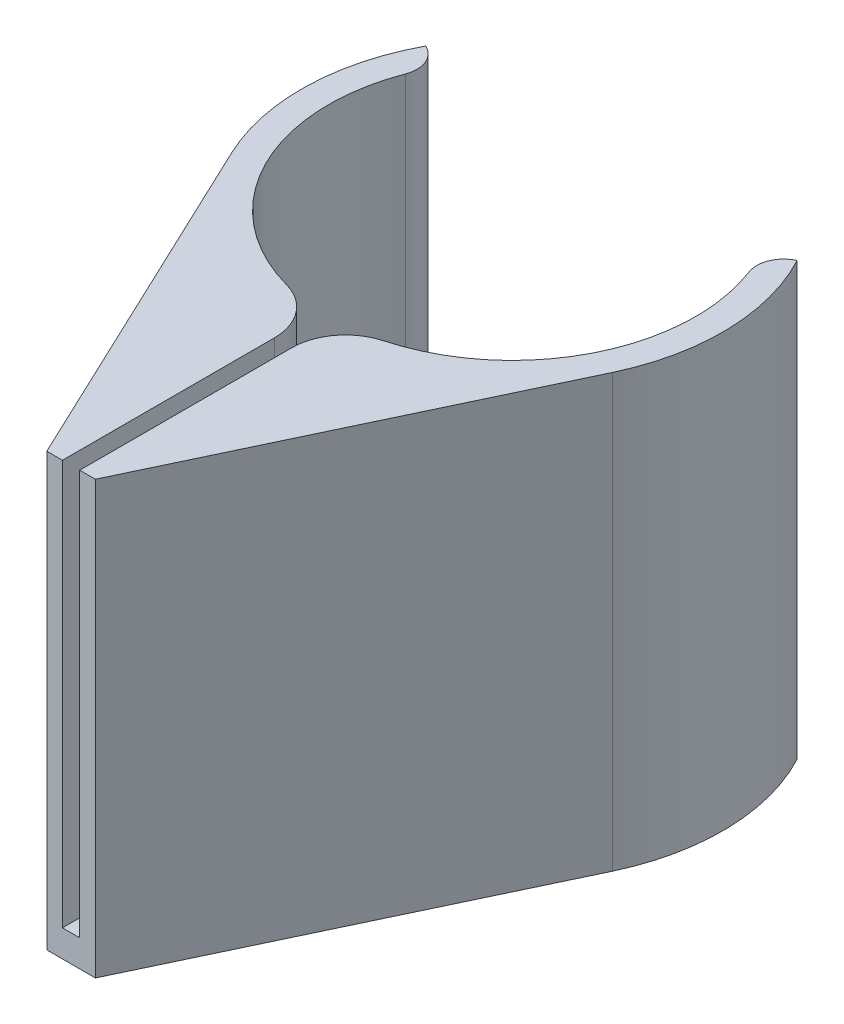
ISO-10303-21;
HEADER;
FILE_DESCRIPTION(('STEP AP214'),'2;1');
FILE_NAME('part.step','',(''),(''),'','','');
FILE_SCHEMA(('AUTOMOTIVE_DESIGN { 1 0 10303 214 1 1 1 1 }'));
ENDSEC;
DATA;
#1=APPLICATION_CONTEXT('core data for automotive mechanical design processes');
#2=APPLICATION_PROTOCOL_DEFINITION('international standard','automotive_design',2000,#1);
#3=PRODUCT_CONTEXT('',#1,'mechanical');
#4=PRODUCT('Part','Part','',(#3));
#5=PRODUCT_RELATED_PRODUCT_CATEGORY('part','',(#4));
#6=PRODUCT_DEFINITION_FORMATION('','',#4);
#7=PRODUCT_DEFINITION_CONTEXT('part definition',#1,'design');
#8=PRODUCT_DEFINITION('design','',#6,#7);
#9=PRODUCT_DEFINITION_SHAPE('','',#8);
#10=(LENGTH_UNIT() NAMED_UNIT(*) SI_UNIT(.MILLI.,.METRE.));
#11=(NAMED_UNIT(*) PLANE_ANGLE_UNIT() SI_UNIT($,.RADIAN.));
#12=(NAMED_UNIT(*) SI_UNIT($,.STERADIAN.) SOLID_ANGLE_UNIT());
#13=UNCERTAINTY_MEASURE_WITH_UNIT(LENGTH_MEASURE(1.E-05),#10,'distance_accuracy_value','');
#14=(GEOMETRIC_REPRESENTATION_CONTEXT(3) GLOBAL_UNCERTAINTY_ASSIGNED_CONTEXT((#13)) GLOBAL_UNIT_ASSIGNED_CONTEXT((#10,
#11,#12)) REPRESENTATION_CONTEXT('',''));
#15=CARTESIAN_POINT('',(0.,0.,0.));
#16=DIRECTION('',(0.,0.,1.));
#17=DIRECTION('',(1.,0.,0.));
#18=AXIS2_PLACEMENT_3D('',#15,#16,#17);
#19=CARTESIAN_POINT('',(0.,80.,0.));
#20=DIRECTION('',(0.,-1.,0.));
#21=DIRECTION('',(0.,0.,-1.));
#22=AXIS2_PLACEMENT_3D('',#19,#20,#21);
#23=CYLINDRICAL_SURFACE('',#22,34.);
#24=CARTESIAN_POINT('',(0.,80.,0.));
#25=DIRECTION('',(0.,1.,0.));
#26=DIRECTION('',(0.,0.,1.));
#27=AXIS2_PLACEMENT_3D('',#24,#25,#26);
#28=CIRCLE('',#27,34.);
#29=CARTESIAN_POINT('',(8.96363636363636,80.,32.797152668189));
#30=VERTEX_POINT('',#29);
#31=CARTESIAN_POINT('',(31.7886601793852,80.,-12.0615539628844));
#32=VERTEX_POINT('',#31);
#33=EDGE_CURVE('E399',#30,#32,#28,.T.);
#34=ORIENTED_EDGE('',*,*,#33,.T.);
#35=DIRECTION('',(0.,-1.,0.));
#36=VECTOR('',#35,1.);
#37=CARTESIAN_POINT('',(31.7886601793852,80.,-12.0615539628844));
#38=LINE('',#37,#36);
#39=CARTESIAN_POINT('',(31.7886601793852,0.,-12.0615539628844));
#40=VERTEX_POINT('',#39);
#41=EDGE_CURVE('E387',#32,#40,#38,.T.);
#42=ORIENTED_EDGE('',*,*,#41,.T.);
#43=CARTESIAN_POINT('',(0.,0.,0.));
#44=DIRECTION('',(0.,1.,0.));
#45=DIRECTION('',(0.,0.,1.));
#46=AXIS2_PLACEMENT_3D('',#43,#44,#45);
#47=CIRCLE('',#46,34.);
#48=CARTESIAN_POINT('',(8.96363636363636,0.,32.797152668189));
#49=VERTEX_POINT('',#48);
#50=EDGE_CURVE('E223',#49,#40,#47,.T.);
#51=ORIENTED_EDGE('',*,*,#50,.F.);
#52=DIRECTION('',(0.,-1.,0.));
#53=VECTOR('',#52,1.);
#54=CARTESIAN_POINT('',(8.96363636363636,80.,32.797152668189));
#55=LINE('',#54,#53);
#56=EDGE_CURVE('E275',#49,#30,#55,.F.);
#57=ORIENTED_EDGE('',*,*,#56,.T.);
#58=EDGE_LOOP('',(#34,#42,#51,#57));
#59=FACE_BOUND('',#58,.T.);
#60=ADVANCED_FACE('F42',(#59),#23,.F.);
#61=CARTESIAN_POINT('',(0.,80.,0.));
#62=DIRECTION('',(0.,1.,0.));
#63=DIRECTION('',(0.,0.,1.));
#64=AXIS2_PLACEMENT_3D('',#61,#62,#63);
#65=PLANE('',#64);
#66=CARTESIAN_POINT('',(-31.7886601793852,80.,-12.0615539628844));
#67=VERTEX_POINT('',#66);
#68=CARTESIAN_POINT('',(-8.96363636363636,80.,32.797152668189));
#69=VERTEX_POINT('',#68);
#70=EDGE_CURVE('E426',#67,#69,#28,.T.);
#71=ORIENTED_EDGE('',*,*,#70,.F.);
#72=CARTESIAN_POINT('',(-36.4634631469418,80.,-13.8353118986027));
#73=DIRECTION('',(0.,1.,0.));
#74=DIRECTION('',(0.,0.,1.));
#75=AXIS2_PLACEMENT_3D('',#72,#73,#74);
#76=CIRCLE('',#75,5.);
#77=CARTESIAN_POINT('',(-33.9634631469418,80.,-18.1654389175249));
#78=VERTEX_POINT('',#77);
#79=EDGE_CURVE('E382',#67,#78,#76,.T.);
#80=ORIENTED_EDGE('',*,*,#79,.T.);
#81=DIRECTION('',(-0.866025403784436,0.,-0.500000000000004));
#82=VECTOR('',#81,1.);
#83=CARTESIAN_POINT('',(-0.625000000000009,80.,1.08253175473055));
#84=LINE('',#83,#82);
#85=CARTESIAN_POINT('',(-34.3826380246011,80.,-18.4074496459791));
#86=VERTEX_POINT('',#85);
#87=EDGE_CURVE('E431',#78,#86,#84,.T.);
#88=ORIENTED_EDGE('',*,*,#87,.T.);
#89=CARTESIAN_POINT('',(0.,80.,0.));
#90=DIRECTION('',(0.,1.,0.));
#91=DIRECTION('',(0.,0.,1.));
#92=AXIS2_PLACEMENT_3D('',#89,#90,#91);
#93=CIRCLE('',#92,39.);
#94=CARTESIAN_POINT('',(-35.2539104463336,80.,16.6781833016037));
#95=VERTEX_POINT('',#94);
#96=EDGE_CURVE('E437',#86,#95,#93,.T.);
#97=ORIENTED_EDGE('',*,*,#96,.T.);
#98=DIRECTION('',(0.427645725682146,0.,0.903946421700861));
#99=VECTOR('',#98,1.);
#100=CARTESIAN_POINT('',(-35.2539104463336,80.,16.6781833016037));
#101=LINE('',#100,#99);
#102=CARTESIAN_POINT('',(-4.50000000000001,80.,81.685));
#103=VERTEX_POINT('',#102);
#104=EDGE_CURVE('E197',#95,#103,#101,.T.);
#105=ORIENTED_EDGE('',*,*,#104,.T.);
#106=DIRECTION('',(1.,0.,0.));
#107=VECTOR('',#106,1.);
#108=CARTESIAN_POINT('',(0.,80.,81.685));
#109=LINE('',#108,#107);
#110=CARTESIAN_POINT('',(-1.6,80.,81.685));
#111=VERTEX_POINT('',#110);
#112=EDGE_CURVE('E187',#103,#111,#109,.T.);
#113=ORIENTED_EDGE('',*,*,#112,.T.);
#114=DIRECTION('',(0.,0.,1.));
#115=VECTOR('',#114,1.);
#116=CARTESIAN_POINT('',(-1.6,80.,81.685));
#117=LINE('',#116,#115);
#118=CARTESIAN_POINT('',(-1.6,80.,42.4433740411858));
#119=VERTEX_POINT('',#118);
#120=EDGE_CURVE('E167',#119,#111,#117,.T.);
#121=ORIENTED_EDGE('',*,*,#120,.F.);
#122=CARTESIAN_POINT('',(-11.6,80.,42.4433740411858));
#123=DIRECTION('',(0.,1.,0.));
#124=DIRECTION('',(0.,0.,1.));
#125=AXIS2_PLACEMENT_3D('',#122,#123,#124);
#126=CIRCLE('',#125,10.);
#127=EDGE_CURVE('E286',#119,#69,#126,.T.);
#128=ORIENTED_EDGE('',*,*,#127,.T.);
#129=EDGE_LOOP('',(#71,#80,#88,#97,#105,#113,#121,#128));
#130=FACE_BOUND('',#129,.T.);
#131=ADVANCED_FACE('F195',(#130),#65,.T.);
#132=CARTESIAN_POINT('',(35.2539104463336,80.,16.6781833016037));
#133=DIRECTION('',(-0.903946421700861,0.,-0.427645725682146));
#134=DIRECTION('',(-0.427645725682146,0.,0.903946421700861));
#135=AXIS2_PLACEMENT_3D('',#132,#133,#134);
#136=PLANE('',#135);
#137=DIRECTION('',(0.427645725682146,0.,-0.903946421700861));
#138=VECTOR('',#137,1.);
#139=CARTESIAN_POINT('',(35.2539104463336,0.,16.6781833016037));
#140=LINE('',#139,#138);
#141=CARTESIAN_POINT('',(4.5,0.,81.685));
#142=VERTEX_POINT('',#141);
#143=CARTESIAN_POINT('',(35.2539104463336,0.,16.6781833016037));
#144=VERTEX_POINT('',#143);
#145=EDGE_CURVE('E211',#142,#144,#140,.T.);
#146=ORIENTED_EDGE('',*,*,#145,.T.);
#147=DIRECTION('',(0.,-1.,0.));
#148=VECTOR('',#147,1.);
#149=CARTESIAN_POINT('',(35.2539104463336,80.,16.6781833016037));
#150=LINE('',#149,#148);
#151=CARTESIAN_POINT('',(35.2539104463336,80.,16.6781833016037));
#152=VERTEX_POINT('',#151);
#153=EDGE_CURVE('E254',#152,#144,#150,.T.);
#154=ORIENTED_EDGE('',*,*,#153,.F.);
#155=DIRECTION('',(0.427645725682146,0.,-0.903946421700861));
#156=VECTOR('',#155,1.);
#157=CARTESIAN_POINT('',(35.2539104463336,80.,16.6781833016037));
#158=LINE('',#157,#156);
#159=CARTESIAN_POINT('',(4.5,80.,81.685));
#160=VERTEX_POINT('',#159);
#161=EDGE_CURVE('E238',#160,#152,#158,.T.);
#162=ORIENTED_EDGE('',*,*,#161,.F.);
#163=DIRECTION('',(0.,-1.,0.));
#164=VECTOR('',#163,1.);
#165=CARTESIAN_POINT('',(4.5,80.,81.685));
#166=LINE('',#165,#164);
#167=EDGE_CURVE('E200',#160,#142,#166,.T.);
#168=ORIENTED_EDGE('',*,*,#167,.T.);
#169=EDGE_LOOP('',(#146,#154,#162,#168));
#170=FACE_BOUND('',#169,.T.);
#171=ADVANCED_FACE('F316',(#170),#136,.F.);
#172=CARTESIAN_POINT('',(0.,80.,0.));
#173=DIRECTION('',(0.,-1.,0.));
#174=DIRECTION('',(0.,0.,-1.));
#175=AXIS2_PLACEMENT_3D('',#172,#173,#174);
#176=CYLINDRICAL_SURFACE('',#175,39.);
#177=CARTESIAN_POINT('',(0.,0.,0.));
#178=DIRECTION('',(0.,1.,0.));
#179=DIRECTION('',(0.,0.,1.));
#180=AXIS2_PLACEMENT_3D('',#177,#178,#179);
#181=CIRCLE('',#180,39.);
#182=CARTESIAN_POINT('',(34.3826380246011,0.,-18.4074496459791));
#183=VERTEX_POINT('',#182);
#184=EDGE_CURVE('E215',#144,#183,#181,.T.);
#185=ORIENTED_EDGE('',*,*,#184,.T.);
#186=DIRECTION('',(0.,-1.,0.));
#187=VECTOR('',#186,1.);
#188=CARTESIAN_POINT('',(34.3826380246011,80.,-18.4074496459791));
#189=LINE('',#188,#187);
#190=CARTESIAN_POINT('',(34.3826380246011,80.,-18.4074496459791));
#191=VERTEX_POINT('',#190);
#192=EDGE_CURVE('E250',#191,#183,#189,.T.);
#193=ORIENTED_EDGE('',*,*,#192,.F.);
#194=CARTESIAN_POINT('',(0.,80.,0.));
#195=DIRECTION('',(0.,1.,0.));
#196=DIRECTION('',(0.,0.,1.));
#197=AXIS2_PLACEMENT_3D('',#194,#195,#196);
#198=CIRCLE('',#197,39.);
#199=EDGE_CURVE('E432',#152,#191,#198,.T.);
#200=ORIENTED_EDGE('',*,*,#199,.F.);
#201=ORIENTED_EDGE('',*,*,#153,.T.);
#202=EDGE_LOOP('',(#185,#193,#200,#201));
#203=FACE_BOUND('',#202,.T.);
#204=ADVANCED_FACE('F372',(#203),#176,.T.);
#205=CARTESIAN_POINT('',(0.625000000000009,80.,1.08253175473055));
#206=DIRECTION('',(-0.500000000000004,0.,-0.866025403784436));
#207=DIRECTION('',(-0.866025403784436,0.,0.500000000000004));
#208=AXIS2_PLACEMENT_3D('',#205,#206,#207);
#209=PLANE('',#208);
#210=DIRECTION('',(0.866025403784436,0.,-0.500000000000004));
#211=VECTOR('',#210,1.);
#212=CARTESIAN_POINT('',(0.625000000000009,0.,1.08253175473055));
#213=LINE('',#212,#211);
#214=CARTESIAN_POINT('',(33.9634631469418,0.,-18.1654389175249));
#215=VERTEX_POINT('',#214);
#216=EDGE_CURVE('E220',#215,#183,#213,.T.);
#217=ORIENTED_EDGE('',*,*,#216,.F.);
#218=DIRECTION('',(0.,-1.,0.));
#219=VECTOR('',#218,1.);
#220=CARTESIAN_POINT('',(33.9634631469418,80.,-18.1654389175249));
#221=LINE('',#220,#219);
#222=CARTESIAN_POINT('',(33.9634631469418,80.,-18.1654389175249));
#223=VERTEX_POINT('',#222);
#224=EDGE_CURVE('E51',#215,#223,#221,.F.);
#225=ORIENTED_EDGE('',*,*,#224,.T.);
#226=DIRECTION('',(0.866025403784436,0.,-0.500000000000004));
#227=VECTOR('',#226,1.);
#228=CARTESIAN_POINT('',(0.625000000000009,80.,1.08253175473055));
#229=LINE('',#228,#227);
#230=EDGE_CURVE('E427',#223,#191,#229,.T.);
#231=ORIENTED_EDGE('',*,*,#230,.T.);
#232=ORIENTED_EDGE('',*,*,#192,.T.);
#233=EDGE_LOOP('',(#217,#225,#231,#232));
#234=FACE_BOUND('',#233,.T.);
#235=ADVANCED_FACE('F364',(#234),#209,.T.);
#236=CARTESIAN_POINT('',(-31.7886601793852,0.,-12.0615539628844));
#237=VERTEX_POINT('',#236);
#238=CARTESIAN_POINT('',(-8.96363636363636,0.,32.797152668189));
#239=VERTEX_POINT('',#238);
#240=EDGE_CURVE('E224',#237,#239,#47,.T.);
#241=ORIENTED_EDGE('',*,*,#240,.F.);
#242=DIRECTION('',(0.,-1.,0.));
#243=VECTOR('',#242,1.);
#244=CARTESIAN_POINT('',(-31.7886601793852,80.,-12.0615539628844));
#245=LINE('',#244,#243);
#246=EDGE_CURVE('E375',#237,#67,#245,.F.);
#247=ORIENTED_EDGE('',*,*,#246,.T.);
#248=ORIENTED_EDGE('',*,*,#70,.T.);
#249=DIRECTION('',(0.,-1.,0.));
#250=VECTOR('',#249,1.);
#251=CARTESIAN_POINT('',(-8.96363636363636,80.,32.797152668189));
#252=LINE('',#251,#250);
#253=EDGE_CURVE('E271',#69,#239,#252,.T.);
#254=ORIENTED_EDGE('',*,*,#253,.T.);
#255=EDGE_LOOP('',(#241,#247,#248,#254));
#256=FACE_BOUND('',#255,.T.);
#257=ADVANCED_FACE('F354',(#256),#23,.F.);
#258=CARTESIAN_POINT('',(-0.625000000000009,80.,1.08253175473055));
#259=DIRECTION('',(-0.500000000000004,0.,0.866025403784436));
#260=DIRECTION('',(0.866025403784436,0.,0.500000000000004));
#261=AXIS2_PLACEMENT_3D('',#258,#259,#260);
#262=PLANE('',#261);
#263=ORIENTED_EDGE('',*,*,#87,.F.);
#264=DIRECTION('',(0.,1.,0.));
#265=VECTOR('',#264,1.);
#266=CARTESIAN_POINT('',(-33.9634631469418,0.,-18.1654389175249));
#267=LINE('',#266,#265);
#268=CARTESIAN_POINT('',(-33.9634631469418,0.,-18.1654389175249));
#269=VERTEX_POINT('',#268);
#270=EDGE_CURVE('E337',#78,#269,#267,.F.);
#271=ORIENTED_EDGE('',*,*,#270,.T.);
#272=DIRECTION('',(-0.866025403784436,0.,-0.500000000000004));
#273=VECTOR('',#272,1.);
#274=CARTESIAN_POINT('',(-0.625000000000009,0.,1.08253175473055));
#275=LINE('',#274,#273);
#276=CARTESIAN_POINT('',(-34.3826380246011,0.,-18.4074496459791));
#277=VERTEX_POINT('',#276);
#278=EDGE_CURVE('E227',#269,#277,#275,.T.);
#279=ORIENTED_EDGE('',*,*,#278,.T.);
#280=DIRECTION('',(0.,-1.,0.));
#281=VECTOR('',#280,1.);
#282=CARTESIAN_POINT('',(-34.3826380246011,80.,-18.4074496459791));
#283=LINE('',#282,#281);
#284=EDGE_CURVE('E246',#86,#277,#283,.T.);
#285=ORIENTED_EDGE('',*,*,#284,.F.);
#286=EDGE_LOOP('',(#263,#271,#279,#285));
#287=FACE_BOUND('',#286,.T.);
#288=ADVANCED_FACE('F363',(#287),#262,.F.);
#289=CARTESIAN_POINT('',(0.,80.,0.));
#290=DIRECTION('',(0.,-1.,0.));
#291=DIRECTION('',(0.,0.,-1.));
#292=AXIS2_PLACEMENT_3D('',#289,#290,#291);
#293=CYLINDRICAL_SURFACE('',#292,39.);
#294=CARTESIAN_POINT('',(0.,0.,0.));
#295=DIRECTION('',(0.,1.,0.));
#296=DIRECTION('',(0.,0.,1.));
#297=AXIS2_PLACEMENT_3D('',#294,#295,#296);
#298=CIRCLE('',#297,39.);
#299=CARTESIAN_POINT('',(-35.2539104463336,0.,16.6781833016037));
#300=VERTEX_POINT('',#299);
#301=EDGE_CURVE('E230',#277,#300,#298,.T.);
#302=ORIENTED_EDGE('',*,*,#301,.T.);
#303=DIRECTION('',(0.,-1.,0.));
#304=VECTOR('',#303,1.);
#305=CARTESIAN_POINT('',(-35.2539104463336,80.,16.6781833016037));
#306=LINE('',#305,#304);
#307=EDGE_CURVE('E242',#95,#300,#306,.T.);
#308=ORIENTED_EDGE('',*,*,#307,.F.);
#309=ORIENTED_EDGE('',*,*,#96,.F.);
#310=ORIENTED_EDGE('',*,*,#284,.T.);
#311=EDGE_LOOP('',(#302,#308,#309,#310));
#312=FACE_BOUND('',#311,.T.);
#313=ADVANCED_FACE('F370',(#312),#293,.T.);
#314=CARTESIAN_POINT('',(-35.2539104463336,80.,16.6781833016037));
#315=DIRECTION('',(0.903946421700861,0.,-0.427645725682146));
#316=DIRECTION('',(-0.427645725682146,0.,-0.903946421700861));
#317=AXIS2_PLACEMENT_3D('',#314,#315,#316);
#318=PLANE('',#317);
#319=DIRECTION('',(0.427645725682146,0.,0.903946421700861));
#320=VECTOR('',#319,1.);
#321=CARTESIAN_POINT('',(-35.2539104463336,0.,16.6781833016037));
#322=LINE('',#321,#320);
#323=CARTESIAN_POINT('',(-4.50000000000001,0.,81.685));
#324=VERTEX_POINT('',#323);
#325=EDGE_CURVE('E233',#300,#324,#322,.T.);
#326=ORIENTED_EDGE('',*,*,#325,.T.);
#327=DIRECTION('',(0.,-1.,0.));
#328=VECTOR('',#327,1.);
#329=CARTESIAN_POINT('',(-4.50000000000001,80.,81.685));
#330=LINE('',#329,#328);
#331=EDGE_CURVE('E206',#103,#324,#330,.T.);
#332=ORIENTED_EDGE('',*,*,#331,.F.);
#333=ORIENTED_EDGE('',*,*,#104,.F.);
#334=ORIENTED_EDGE('',*,*,#307,.T.);
#335=EDGE_LOOP('',(#326,#332,#333,#334));
#336=FACE_BOUND('',#335,.T.);
#337=ADVANCED_FACE('F448',(#336),#318,.F.);
#338=CARTESIAN_POINT('',(0.,80.,81.685));
#339=DIRECTION('',(0.,0.,-1.));
#340=DIRECTION('',(-1.,0.,0.));
#341=AXIS2_PLACEMENT_3D('',#338,#339,#340);
#342=PLANE('',#341);
#343=DIRECTION('',(-1.,0.,0.));
#344=VECTOR('',#343,1.);
#345=CARTESIAN_POINT('',(-1.6,5.,81.685));
#346=LINE('',#345,#344);
#347=CARTESIAN_POINT('',(1.6,5.,81.685));
#348=VERTEX_POINT('',#347);
#349=CARTESIAN_POINT('',(-1.6,5.,81.685));
#350=VERTEX_POINT('',#349);
#351=EDGE_CURVE('E190',#348,#350,#346,.T.);
#352=ORIENTED_EDGE('',*,*,#351,.T.);
#353=DIRECTION('',(0.,1.,0.));
#354=VECTOR('',#353,1.);
#355=CARTESIAN_POINT('',(-1.6,-47.8298341398053,81.685));
#356=LINE('',#355,#354);
#357=EDGE_CURVE('E172',#350,#111,#356,.T.);
#358=ORIENTED_EDGE('',*,*,#357,.T.);
#359=ORIENTED_EDGE('',*,*,#112,.F.);
#360=ORIENTED_EDGE('',*,*,#331,.T.);
#361=DIRECTION('',(1.,0.,0.));
#362=VECTOR('',#361,1.);
#363=CARTESIAN_POINT('',(0.,0.,81.685));
#364=LINE('',#363,#362);
#365=EDGE_CURVE('E236',#324,#142,#364,.T.);
#366=ORIENTED_EDGE('',*,*,#365,.T.);
#367=ORIENTED_EDGE('',*,*,#167,.F.);
#368=CARTESIAN_POINT('',(1.6,80.,81.685));
#369=VERTEX_POINT('',#368);
#370=EDGE_CURVE('E201',#369,#160,#109,.T.);
#371=ORIENTED_EDGE('',*,*,#370,.F.);
#372=DIRECTION('',(0.,1.,0.));
#373=VECTOR('',#372,1.);
#374=CARTESIAN_POINT('',(1.6,-47.8298341398053,81.685));
#375=LINE('',#374,#373);
#376=EDGE_CURVE('E180',#348,#369,#375,.T.);
#377=ORIENTED_EDGE('',*,*,#376,.F.);
#378=EDGE_LOOP('',(#352,#358,#359,#360,#366,#367,#371,#377));
#379=FACE_BOUND('',#378,.T.);
#380=ADVANCED_FACE('F185',(#379),#342,.F.);
#381=ORIENTED_EDGE('',*,*,#230,.F.);
#382=CARTESIAN_POINT('',(36.4634631469418,80.,-13.8353118986027));
#383=DIRECTION('',(0.,1.,0.));
#384=DIRECTION('',(0.,0.,1.));
#385=AXIS2_PLACEMENT_3D('',#382,#383,#384);
#386=CIRCLE('',#385,5.);
#387=EDGE_CURVE('E12',#223,#32,#386,.T.);
#388=ORIENTED_EDGE('',*,*,#387,.T.);
#389=ORIENTED_EDGE('',*,*,#33,.F.);
#390=CARTESIAN_POINT('',(11.6,80.,42.4433740411858));
#391=DIRECTION('',(0.,1.,0.));
#392=DIRECTION('',(0.,0.,1.));
#393=AXIS2_PLACEMENT_3D('',#390,#391,#392);
#394=CIRCLE('',#393,10.);
#395=CARTESIAN_POINT('',(1.6,80.,42.4433740411858));
#396=VERTEX_POINT('',#395);
#397=EDGE_CURVE('E278',#30,#396,#394,.T.);
#398=ORIENTED_EDGE('',*,*,#397,.T.);
#399=DIRECTION('',(0.,0.,-1.));
#400=VECTOR('',#399,1.);
#401=CARTESIAN_POINT('',(1.6,80.,81.685));
#402=LINE('',#401,#400);
#403=EDGE_CURVE('E181',#369,#396,#402,.T.);
#404=ORIENTED_EDGE('',*,*,#403,.F.);
#405=ORIENTED_EDGE('',*,*,#370,.T.);
#406=ORIENTED_EDGE('',*,*,#161,.T.);
#407=ORIENTED_EDGE('',*,*,#199,.T.);
#408=EDGE_LOOP('',(#381,#388,#389,#398,#404,#405,#406,#407));
#409=FACE_BOUND('',#408,.T.);
#410=ADVANCED_FACE('F359',(#409),#65,.T.);
#411=CARTESIAN_POINT('',(0.,0.,0.));
#412=DIRECTION('',(0.,1.,0.));
#413=DIRECTION('',(0.,0.,1.));
#414=AXIS2_PLACEMENT_3D('',#411,#412,#413);
#415=PLANE('',#414);
#416=ORIENTED_EDGE('',*,*,#278,.F.);
#417=CARTESIAN_POINT('',(-36.4634631469418,0.,-13.8353118986027));
#418=DIRECTION('',(0.,1.,0.));
#419=DIRECTION('',(0.,0.,1.));
#420=AXIS2_PLACEMENT_3D('',#417,#418,#419);
#421=CIRCLE('',#420,5.);
#422=EDGE_CURVE('E380',#269,#237,#421,.F.);
#423=ORIENTED_EDGE('',*,*,#422,.T.);
#424=ORIENTED_EDGE('',*,*,#240,.T.);
#425=CARTESIAN_POINT('',(-11.6,0.,42.4433740411858));
#426=DIRECTION('',(0.,1.,0.));
#427=DIRECTION('',(0.,0.,1.));
#428=AXIS2_PLACEMENT_3D('',#425,#426,#427);
#429=CIRCLE('',#428,10.);
#430=CARTESIAN_POINT('',(-4.92816498885237,0.,34.9944400514108));
#431=VERTEX_POINT('',#430);
#432=EDGE_CURVE('E258',#239,#431,#429,.F.);
#433=ORIENTED_EDGE('',*,*,#432,.T.);
#434=CARTESIAN_POINT('',(0.,0.,0.));
#435=DIRECTION('',(0.,1.,0.));
#436=DIRECTION('',(0.,0.,1.));
#437=AXIS2_PLACEMENT_3D('',#434,#435,#436);
#438=CIRCLE('',#437,35.3397459621556);
#439=CARTESIAN_POINT('',(4.92816498885347,0.,34.9944400514186));
#440=VERTEX_POINT('',#439);
#441=EDGE_CURVE('E261',#431,#440,#438,.T.);
#442=ORIENTED_EDGE('',*,*,#441,.T.);
#443=CARTESIAN_POINT('',(11.6,0.,42.4433740411858));
#444=DIRECTION('',(0.,1.,0.));
#445=DIRECTION('',(0.,0.,1.));
#446=AXIS2_PLACEMENT_3D('',#443,#444,#445);
#447=CIRCLE('',#446,10.);
#448=EDGE_CURVE('E264',#440,#49,#447,.F.);
#449=ORIENTED_EDGE('',*,*,#448,.T.);
#450=ORIENTED_EDGE('',*,*,#50,.T.);
#451=CARTESIAN_POINT('',(36.4634631469418,0.,-13.8353118986027));
#452=DIRECTION('',(0.,1.,0.));
#453=DIRECTION('',(0.,0.,1.));
#454=AXIS2_PLACEMENT_3D('',#451,#452,#453);
#455=CIRCLE('',#454,5.);
#456=EDGE_CURVE('E389',#40,#215,#455,.F.);
#457=ORIENTED_EDGE('',*,*,#456,.T.);
#458=ORIENTED_EDGE('',*,*,#216,.T.);
#459=ORIENTED_EDGE('',*,*,#184,.F.);
#460=ORIENTED_EDGE('',*,*,#145,.F.);
#461=ORIENTED_EDGE('',*,*,#365,.F.);
#462=ORIENTED_EDGE('',*,*,#325,.F.);
#463=ORIENTED_EDGE('',*,*,#301,.F.);
#464=EDGE_LOOP('',(#416,#423,#424,#433,#442,#449,#450,#457,#458,#459,#460,#461,#462,#463));
#465=FACE_BOUND('',#464,.T.);
#466=ADVANCED_FACE('F401',(#465),#415,.F.);
#467=CARTESIAN_POINT('',(-1.6,-47.8298341398053,81.685));
#468=DIRECTION('',(-1.,0.,0.));
#469=DIRECTION('',(0.,0.,1.));
#470=AXIS2_PLACEMENT_3D('',#467,#468,#469);
#471=PLANE('',#470);
#472=CARTESIAN_POINT('',(-1.6,5.,43.9708994677162));
#473=CARTESIAN_POINT('',(-1.6,4.99997098898346,43.7148155740385));
#474=CARTESIAN_POINT('',(-1.6,4.99019034952841,43.4594798371071));
#475=CARTESIAN_POINT('',(-1.6,4.9511258151454,42.9503046950378));
#476=CARTESIAN_POINT('',(-1.6,4.92184192161945,42.6964652897925));
#477=CARTESIAN_POINT('',(-1.6,4.88280640105699,42.4433740411858));
#478=B_SPLINE_CURVE_WITH_KNOTS('',3,(#472,#473,#474,#475,#476,#477),.UNSPECIFIED.,.F.,.F.,(4,2,
4),(0.,0.766568976128166,1.5331378971511),.UNSPECIFIED.);
#479=CARTESIAN_POINT('',(-1.6,5.,43.9708994677162));
#480=VERTEX_POINT('',#479);
#481=CARTESIAN_POINT('',(-1.6,4.88280640105699,42.4433740411858));
#482=VERTEX_POINT('',#481);
#483=EDGE_CURVE('E298',#480,#482,#478,.T.);
#484=ORIENTED_EDGE('',*,*,#483,.T.);
#485=DIRECTION('',(0.,1.,0.));
#486=VECTOR('',#485,1.);
#487=CARTESIAN_POINT('',(-1.6,80.,42.4433740411858));
#488=LINE('',#487,#486);
#489=EDGE_CURVE('E174',#482,#119,#488,.T.);
#490=ORIENTED_EDGE('',*,*,#489,.T.);
#491=ORIENTED_EDGE('',*,*,#120,.T.);
#492=ORIENTED_EDGE('',*,*,#357,.F.);
#493=DIRECTION('',(0.,0.,-1.));
#494=VECTOR('',#493,1.);
#495=CARTESIAN_POINT('',(-1.6,5.,81.685));
#496=LINE('',#495,#494);
#497=EDGE_CURVE('E192',#350,#480,#496,.T.);
#498=ORIENTED_EDGE('',*,*,#497,.T.);
#499=EDGE_LOOP('',(#484,#490,#491,#492,#498));
#500=FACE_BOUND('',#499,.T.);
#501=ADVANCED_FACE('F170',(#500),#471,.F.);
#502=CARTESIAN_POINT('',(1.6,-47.8298341398053,81.685));
#503=DIRECTION('',(1.,0.,0.));
#504=DIRECTION('',(0.,0.,-1.));
#505=AXIS2_PLACEMENT_3D('',#502,#503,#504);
#506=PLANE('',#505);
#507=ORIENTED_EDGE('',*,*,#403,.T.);
#508=DIRECTION('',(0.,1.,0.));
#509=VECTOR('',#508,1.);
#510=CARTESIAN_POINT('',(1.6,4.99999999999999,42.4433740411858));
#511=LINE('',#510,#509);
#512=CARTESIAN_POINT('',(1.6,4.88280640105699,42.4433740411858));
#513=VERTEX_POINT('',#512);
#514=EDGE_CURVE('E281',#396,#513,#511,.F.);
#515=ORIENTED_EDGE('',*,*,#514,.T.);
#516=CARTESIAN_POINT('',(1.6,4.88280640105699,42.4433740411858));
#517=CARTESIAN_POINT('',(1.6,4.92184192161945,42.6964652897925));
#518=CARTESIAN_POINT('',(1.6,4.9511258151454,42.9503046950378));
#519=CARTESIAN_POINT('',(1.6,4.99019034952841,43.4594798371071));
#520=CARTESIAN_POINT('',(1.6,4.99997098898345,43.7148155740385));
#521=CARTESIAN_POINT('',(1.6,4.99999999999999,43.9708994677162));
#522=B_SPLINE_CURVE_WITH_KNOTS('',3,(#516,#517,#518,#519,#520,#521),.UNSPECIFIED.,.F.,.F.,(4,2,
4),(0.,0.76656892102293,1.5331378971511),.UNSPECIFIED.);
#523=CARTESIAN_POINT('',(1.6,5.,43.9708994677162));
#524=VERTEX_POINT('',#523);
#525=EDGE_CURVE('E289',#513,#524,#522,.T.);
#526=ORIENTED_EDGE('',*,*,#525,.T.);
#527=DIRECTION('',(0.,0.,1.));
#528=VECTOR('',#527,1.);
#529=CARTESIAN_POINT('',(1.6,5.,81.685));
#530=LINE('',#529,#528);
#531=EDGE_CURVE('E216',#524,#348,#530,.T.);
#532=ORIENTED_EDGE('',*,*,#531,.T.);
#533=ORIENTED_EDGE('',*,*,#376,.T.);
#534=EDGE_LOOP('',(#507,#515,#526,#532,#533));
#535=FACE_BOUND('',#534,.T.);
#536=ADVANCED_FACE('F305',(#535),#506,.F.);
#537=CARTESIAN_POINT('',(0.,5.,0.));
#538=DIRECTION('',(0.,1.,0.));
#539=DIRECTION('',(0.,0.,1.));
#540=AXIS2_PLACEMENT_3D('',#537,#538,#539);
#541=PLANE('',#540);
#542=ORIENTED_EDGE('',*,*,#531,.F.);
#543=CARTESIAN_POINT('',(0.,5.,0.));
#544=DIRECTION('',(0.,1.,0.));
#545=DIRECTION('',(0.,0.,1.));
#546=AXIS2_PLACEMENT_3D('',#543,#544,#545);
#547=CIRCLE('',#546,44.);
#548=EDGE_CURVE('E267',#524,#480,#547,.F.);
#549=ORIENTED_EDGE('',*,*,#548,.T.);
#550=ORIENTED_EDGE('',*,*,#497,.F.);
#551=ORIENTED_EDGE('',*,*,#351,.F.);
#552=EDGE_LOOP('',(#542,#549,#550,#551));
#553=FACE_BOUND('',#552,.T.);
#554=ADVANCED_FACE('F342',(#553),#541,.T.);
#555=CARTESIAN_POINT('',(-11.6,80.,42.4433740411858));
#556=DIRECTION('',(0.,-1.,0.));
#557=DIRECTION('',(0.,0.,-1.));
#558=AXIS2_PLACEMENT_3D('',#555,#556,#557);
#559=CYLINDRICAL_SURFACE('',#558,10.);
#560=ORIENTED_EDGE('',*,*,#489,.F.);
#561=CARTESIAN_POINT('',(-8.96363636363636,-5.,32.797152668189));
#562=CARTESIAN_POINT('',(-8.95939060102163,-4.99499290817184,32.7983130649477));
#563=CARTESIAN_POINT('',(-8.95514558023159,-4.98998578996363,32.7994762640892));
#564=CARTESIAN_POINT('',(-8.56255176797866,-4.52682745378346,32.9073309118515));
#565=CARTESIAN_POINT('',(-8.18042164025167,-4.06848272327391,33.0374840707654));
#566=CARTESIAN_POINT('',(-7.42985252367336,-3.15598743507233,33.3453168097569));
#567=CARTESIAN_POINT('',(-7.06142642813644,-2.70184111487526,33.5230399186667));
#568=CARTESIAN_POINT('',(-6.34009463267574,-1.80243591527148,33.9284045928461));
#569=CARTESIAN_POINT('',(-5.98720332755883,-1.3571854792086,34.1560913330554));
#570=CARTESIAN_POINT('',(-5.47281933945912,-0.701364961358311,34.5374856759609));
#571=CARTESIAN_POINT('',(-5.30391095183194,-0.484846560487416,34.6712033275476));
#572=CARTESIAN_POINT('',(-4.97160481803496,-0.056602243511141,34.9525926357133));
#573=CARTESIAN_POINT('',(-4.80820764246926,0.15512317561051,35.1002657311902));
#574=CARTESIAN_POINT('',(-4.47958700263967,0.583324474121336,35.4180909458943));
#575=CARTESIAN_POINT('',(-4.31469584443203,0.799491417513484,35.5890056226493));
#576=CARTESIAN_POINT('',(-3.99317205290233,1.22377423774918,35.9476712448342));
#577=CARTESIAN_POINT('',(-3.83653709122659,1.43189238000171,36.1354174027926));
#578=CARTESIAN_POINT('',(-3.53320557353226,1.83810401271522,36.5282806175706));
#579=CARTESIAN_POINT('',(-3.38649530018161,2.03621123966472,36.7333727787851));
#580=CARTESIAN_POINT('',(-3.10466371629398,2.42062579103741,37.161804305974));
#581=CARTESIAN_POINT('',(-2.96954024177399,2.60693531712489,37.385140249408));
#582=CARTESIAN_POINT('',(-2.73774500196447,2.93097192326777,37.8058600758496));
#583=CARTESIAN_POINT('',(-2.63866659092628,3.07116745649648,38.0000164975448));
#584=CARTESIAN_POINT('',(-2.45101121956777,3.34077338453973,38.4004938906866));
#585=CARTESIAN_POINT('',(-2.36243170600383,3.47018639928873,38.6068118861904));
#586=CARTESIAN_POINT('',(-2.19741728775022,3.71652705041184,39.0311590222986));
#587=CARTESIAN_POINT('',(-2.1209707581159,3.83346660228288,39.2491766817719));
#588=CARTESIAN_POINT('',(-1.98183942625555,4.05327840459391,39.6964148492459));
#589=CARTESIAN_POINT('',(-1.91915115129123,4.15615420240562,39.9256325123388));
#590=CARTESIAN_POINT('',(-1.8218307219191,4.32441446852887,40.3405499612643));
#591=CARTESIAN_POINT('',(-1.78406084117151,4.3929943074968,40.5242254754156));
#592=CARTESIAN_POINT('',(-1.71851270159132,4.52001574899757,40.8967772370656));
#593=CARTESIAN_POINT('',(-1.69073245225928,4.57845937003536,41.0856524404087));
#594=CARTESIAN_POINT('',(-1.64586189669154,4.68453175191291,41.4676184163687));
#595=CARTESIAN_POINT('',(-1.62876864272054,4.73216349262349,41.6607080113324));
#596=CARTESIAN_POINT('',(-1.60583701274833,4.81608765581071,42.0500176786297));
#597=CARTESIAN_POINT('',(-1.59999938713767,4.85237932213182,42.2462379588006));
#598=CARTESIAN_POINT('',(-1.60000065237928,4.91519539765235,42.6532213261288));
#599=CARTESIAN_POINT('',(-1.60661670761158,4.94093913500206,42.8641063214377));
#600=CARTESIAN_POINT('',(-1.63334054273107,4.97890998523666,43.286245113294));
#601=CARTESIAN_POINT('',(-1.65344877977217,4.99113664008677,43.497498922096));
#602=CARTESIAN_POINT('',(-1.70714816431533,5.00212209730521,43.9186930497877));
#603=CARTESIAN_POINT('',(-1.74074287866074,5.00087733455057,44.1286330062662));
#604=CARTESIAN_POINT('',(-1.82113107200414,4.98521969118454,44.5454631285605));
#605=CARTESIAN_POINT('',(-1.86792456186637,4.97080679973412,44.7523532918657));
#606=CARTESIAN_POINT('',(-1.97400188631158,4.92942167384862,45.1608238293153));
#607=CARTESIAN_POINT('',(-2.03324107156491,4.90249392912273,45.3624203615686));
#608=CARTESIAN_POINT('',(-2.1636096968772,4.83679750497618,45.7597362305338));
#609=CARTESIAN_POINT('',(-2.23473918665164,4.79802877604566,45.955455542668));
#610=CARTESIAN_POINT('',(-2.38806726386639,4.70946596924282,46.3399280299315));
#611=CARTESIAN_POINT('',(-2.47026623352988,4.65967151061971,46.5286809642287));
#612=CARTESIAN_POINT('',(-2.64486726458826,4.54991648172946,46.898418611121));
#613=CARTESIAN_POINT('',(-2.73727329396708,4.48995195297337,47.0794002644005));
#614=CARTESIAN_POINT('',(-2.93522427657863,4.35817878592574,47.4399343101914));
#615=CARTESIAN_POINT('',(-3.04114633722037,4.28599306158334,47.619141617572));
#616=CARTESIAN_POINT('',(-3.26199995188247,4.13257419929979,47.9679024751608));
#617=CARTESIAN_POINT('',(-3.37693490254643,4.05133764551684,48.137452343857));
#618=CARTESIAN_POINT('',(-3.73380018103946,3.79544036924058,48.6310704596592));
#619=CARTESIAN_POINT('',(-3.98787007011883,3.60853891934198,48.9402492247723));
#620=CARTESIAN_POINT('',(-4.45742763057996,3.25655020978042,49.4486220488431));
#621=CARTESIAN_POINT('',(-4.66775159624308,3.09682110716523,49.6564997230139));
#622=CARTESIAN_POINT('',(-5.10033128903248,2.76470399942364,50.0486019313782));
#623=CARTESIAN_POINT('',(-5.32259157586899,2.59231114732331,50.2328173340516));
#624=CARTESIAN_POINT('',(-5.77702143210273,2.23667807683987,50.578146112616));
#625=CARTESIAN_POINT('',(-6.0092083474066,2.05341863424441,50.7392167092307));
#626=CARTESIAN_POINT('',(-6.48099549591478,1.67814422870957,51.0383651679));
#627=CARTESIAN_POINT('',(-6.72059569154165,1.48612931014879,51.1764431464801));
#628=CARTESIAN_POINT('',(-7.58686306493184,0.786978343676697,51.6297732647279));
#629=CARTESIAN_POINT('',(-8.23039165551337,0.258591337689089,51.8826697187031));
#630=CARTESIAN_POINT('',(-9.20466780548641,-0.55529917113699,52.1581464594013));
#631=CARTESIAN_POINT('',(-9.53117730005537,-0.830366570960473,52.2326779042213));
#632=CARTESIAN_POINT('',(-10.1852862953831,-1.3863355068423,52.3483580347944));
#633=CARTESIAN_POINT('',(-10.5128855954109,-1.66723601359891,52.3895125597075));
#634=CARTESIAN_POINT('',(-11.1274470458429,-2.19917804452192,52.4363675846471));
#635=CARTESIAN_POINT('',(-11.4145547391503,-2.44974435204231,52.445738989436));
#636=CARTESIAN_POINT('',(-11.986367141314,-2.95321634887748,52.4399998275615));
#637=CARTESIAN_POINT('',(-12.2710717228176,-3.20612216070385,52.424887971497));
#638=CARTESIAN_POINT('',(-13.1185293922385,-3.96618426140388,52.3436439801506));
#639=CARTESIAN_POINT('',(-13.6761945605862,-4.47603895527321,52.241716389953));
#640=CARTESIAN_POINT('',(-14.2257858206943,-4.99010263742433,52.0924817192817));
#641=CARTESIAN_POINT('',(-14.2310753629326,-4.99505135565736,52.0910407328896));
#642=CARTESIAN_POINT('',(-14.2363636363636,-5.,52.0895954141825));
#643=B_SPLINE_CURVE_WITH_KNOTS('',3,(#561,#562,#563,#564,#565,#566,#567,#568,#569,#570,#571,
#572,#573,#574,#575,#576,#577,#578,#579,#580,#581,#582,#583,#584,#585,#586,#587,#588,#589,#590,
#591,#592,#593,#594,#595,#596,#597,#598,#599,#600,#601,#602,#603,#604,#605,#606,#607,#608,#609,
#610,#611,#612,#613,#614,#615,#616,#617,#618,#619,#620,#621,#622,#623,#624,#625,#626,#627,#628,
#629,#630,#631,#632,#633,#634,#635,#636,#637,#638,#639,#640,#641,#642),.UNSPECIFIED.,.F.,.F.,(4,
2,2,2,2,2,2,2,2,2,2,2,2,2,2,2,2,2,2,2,2,2,2,2,2,2,2,2,2,2,2,2,2,2,2,2,2,2,2,2,4),(0.,
0.0200000019000842,1.84999124307791,3.6816627746009,5.51499729796696,6.43097512381636,
7.34704749625025,8.3098673732665,9.27241425375551,10.2336023633611,11.1946105660151,
11.9714720552303,12.748144228926,13.5240676998393,14.2997950931141,14.8982670452382,
15.4966196817445,16.0948072050306,16.69303460692,17.3298353110132,17.9666575928346,
18.6036484096472,19.2406397507838,19.875383738522,20.5101303803056,21.1448989451719,
21.779915149954,22.4402658215037,23.1008665633509,24.4215594519479,25.4286545035794,
26.436137043571,27.4454584309528,28.4547747029885,31.0493893009309,32.3486887341533,
33.6477608110188,34.7904844761814,35.9332683243829,38.2126526597888,38.2348091322931),.UNSPECIFIED.);
#644=EDGE_CURVE('E329',#431,#482,#643,.T.);
#645=ORIENTED_EDGE('',*,*,#644,.F.);
#646=ORIENTED_EDGE('',*,*,#432,.F.);
#647=ORIENTED_EDGE('',*,*,#253,.F.);
#648=ORIENTED_EDGE('',*,*,#127,.F.);
#649=EDGE_LOOP('',(#560,#645,#646,#647,#648));
#650=FACE_BOUND('',#649,.T.);
#651=ADVANCED_FACE('F339',(#650),#559,.T.);
#652=CARTESIAN_POINT('',(11.6,80.,42.4433740411858));
#653=DIRECTION('',(0.,-1.,0.));
#654=DIRECTION('',(0.,0.,-1.));
#655=AXIS2_PLACEMENT_3D('',#652,#653,#654);
#656=CYLINDRICAL_SURFACE('',#655,10.);
#657=ORIENTED_EDGE('',*,*,#56,.F.);
#658=ORIENTED_EDGE('',*,*,#448,.F.);
#659=CARTESIAN_POINT('',(8.96363636363636,-5.,32.797152668189));
#660=CARTESIAN_POINT('',(8.95939060102163,-4.99499290817184,32.7983130649477));
#661=CARTESIAN_POINT('',(8.95514558023159,-4.98998578996363,32.7994762640892));
#662=CARTESIAN_POINT('',(8.56255176797866,-4.52682745378346,32.9073309118515));
#663=CARTESIAN_POINT('',(8.18042164025167,-4.06848272327391,33.0374840707654));
#664=CARTESIAN_POINT('',(7.42985252367336,-3.15598743507233,33.3453168097569));
#665=CARTESIAN_POINT('',(7.06142642813644,-2.70184111487526,33.5230399186667));
#666=CARTESIAN_POINT('',(6.34009463267574,-1.80243591527148,33.9284045928461));
#667=CARTESIAN_POINT('',(5.98720332755883,-1.3571854792086,34.1560913330554));
#668=CARTESIAN_POINT('',(5.47281933945912,-0.701364961358311,34.5374856759609));
#669=CARTESIAN_POINT('',(5.30391095183194,-0.484846560487416,34.6712033275476));
#670=CARTESIAN_POINT('',(4.97160481803496,-0.056602243511141,34.9525926357133));
#671=CARTESIAN_POINT('',(4.80820764246926,0.15512317561051,35.1002657311902));
#672=CARTESIAN_POINT('',(4.47958700263967,0.583324474121336,35.4180909458943));
#673=CARTESIAN_POINT('',(4.31469584443203,0.799491417513484,35.5890056226493));
#674=CARTESIAN_POINT('',(3.99317205290233,1.22377423774918,35.9476712448342));
#675=CARTESIAN_POINT('',(3.83653709122659,1.43189238000171,36.1354174027926));
#676=CARTESIAN_POINT('',(3.53320557353226,1.83810401271522,36.5282806175706));
#677=CARTESIAN_POINT('',(3.38649530018161,2.03621123966472,36.7333727787851));
#678=CARTESIAN_POINT('',(3.10466371629398,2.42062579103741,37.161804305974));
#679=CARTESIAN_POINT('',(2.96954024177399,2.60693531712489,37.385140249408));
#680=CARTESIAN_POINT('',(2.73774500196447,2.93097192326777,37.8058600758496));
#681=CARTESIAN_POINT('',(2.63866659092628,3.07116745649648,38.0000164975448));
#682=CARTESIAN_POINT('',(2.45101121956777,3.34077338453973,38.4004938906866));
#683=CARTESIAN_POINT('',(2.36243170600383,3.47018639928873,38.6068118861904));
#684=CARTESIAN_POINT('',(2.19741728775022,3.71652705041184,39.0311590222986));
#685=CARTESIAN_POINT('',(2.1209707581159,3.83346660228288,39.2491766817719));
#686=CARTESIAN_POINT('',(1.98183942625555,4.05327840459391,39.6964148492459));
#687=CARTESIAN_POINT('',(1.91915115129123,4.15615420240562,39.9256325123388));
#688=CARTESIAN_POINT('',(1.8218307219191,4.32441446852887,40.3405499612643));
#689=CARTESIAN_POINT('',(1.78406084117151,4.3929943074968,40.5242254754156));
#690=CARTESIAN_POINT('',(1.71851270159132,4.52001574899757,40.8967772370656));
#691=CARTESIAN_POINT('',(1.69073245225928,4.57845937003536,41.0856524404087));
#692=CARTESIAN_POINT('',(1.64586189669154,4.68453175191291,41.4676184163687));
#693=CARTESIAN_POINT('',(1.62876864272054,4.73216349262349,41.6607080113324));
#694=CARTESIAN_POINT('',(1.60583701274833,4.81608765581071,42.0500176786297));
#695=CARTESIAN_POINT('',(1.59999938713767,4.85237932213182,42.2462379588006));
#696=CARTESIAN_POINT('',(1.60000065237928,4.91519539765235,42.6532213261288));
#697=CARTESIAN_POINT('',(1.60661670761158,4.94093913500206,42.8641063214377));
#698=CARTESIAN_POINT('',(1.63334054273107,4.97890998523666,43.286245113294));
#699=CARTESIAN_POINT('',(1.65344877977217,4.99113664008677,43.497498922096));
#700=CARTESIAN_POINT('',(1.70714816431533,5.00212209730521,43.9186930497877));
#701=CARTESIAN_POINT('',(1.74074287866074,5.00087733455057,44.1286330062662));
#702=CARTESIAN_POINT('',(1.82113107200414,4.98521969118454,44.5454631285605));
#703=CARTESIAN_POINT('',(1.86792456186637,4.97080679973412,44.7523532918657));
#704=CARTESIAN_POINT('',(1.97400188631158,4.92942167384862,45.1608238293153));
#705=CARTESIAN_POINT('',(2.03324107156491,4.90249392912273,45.3624203615686));
#706=CARTESIAN_POINT('',(2.1636096968772,4.83679750497618,45.7597362305338));
#707=CARTESIAN_POINT('',(2.23473918665164,4.79802877604566,45.955455542668));
#708=CARTESIAN_POINT('',(2.38806726386639,4.70946596924282,46.3399280299315));
#709=CARTESIAN_POINT('',(2.47026623352988,4.65967151061971,46.5286809642287));
#710=CARTESIAN_POINT('',(2.64486726458826,4.54991648172946,46.898418611121));
#711=CARTESIAN_POINT('',(2.73727329396708,4.48995195297337,47.0794002644005));
#712=CARTESIAN_POINT('',(2.93522427657863,4.35817878592574,47.4399343101914));
#713=CARTESIAN_POINT('',(3.04114633722037,4.28599306158334,47.619141617572));
#714=CARTESIAN_POINT('',(3.26199995188247,4.13257419929979,47.9679024751608));
#715=CARTESIAN_POINT('',(3.37693490254643,4.05133764551684,48.137452343857));
#716=CARTESIAN_POINT('',(3.73380018103946,3.79544036924058,48.6310704596592));
#717=CARTESIAN_POINT('',(3.98787007011883,3.60853891934198,48.9402492247723));
#718=CARTESIAN_POINT('',(4.45742763057996,3.25655020978042,49.4486220488431));
#719=CARTESIAN_POINT('',(4.66775159624308,3.09682110716523,49.6564997230139));
#720=CARTESIAN_POINT('',(5.10033128903248,2.76470399942364,50.0486019313782));
#721=CARTESIAN_POINT('',(5.32259157586899,2.59231114732331,50.2328173340516));
#722=CARTESIAN_POINT('',(5.77702143210273,2.23667807683987,50.578146112616));
#723=CARTESIAN_POINT('',(6.0092083474066,2.05341863424441,50.7392167092307));
#724=CARTESIAN_POINT('',(6.48099549591478,1.67814422870957,51.0383651679));
#725=CARTESIAN_POINT('',(6.72059569154165,1.48612931014879,51.1764431464801));
#726=CARTESIAN_POINT('',(7.58686306493184,0.786978343676697,51.6297732647279));
#727=CARTESIAN_POINT('',(8.23039165551337,0.258591337689089,51.8826697187031));
#728=CARTESIAN_POINT('',(9.20466780548641,-0.55529917113699,52.1581464594013));
#729=CARTESIAN_POINT('',(9.53117730005537,-0.830366570960473,52.2326779042213));
#730=CARTESIAN_POINT('',(10.1852862953831,-1.3863355068423,52.3483580347944));
#731=CARTESIAN_POINT('',(10.5128855954109,-1.66723601359891,52.3895125597075));
#732=CARTESIAN_POINT('',(11.1274470458429,-2.19917804452192,52.4363675846471));
#733=CARTESIAN_POINT('',(11.4145547391503,-2.44974435204231,52.445738989436));
#734=CARTESIAN_POINT('',(11.986367141314,-2.95321634887748,52.4399998275615));
#735=CARTESIAN_POINT('',(12.2710717228176,-3.20612216070385,52.424887971497));
#736=CARTESIAN_POINT('',(13.1185293922385,-3.96618426140388,52.3436439801506));
#737=CARTESIAN_POINT('',(13.6761945605862,-4.47603895527321,52.241716389953));
#738=CARTESIAN_POINT('',(14.2257858206943,-4.99010263742433,52.0924817192817));
#739=CARTESIAN_POINT('',(14.2310753629326,-4.99505135565736,52.0910407328896));
#740=CARTESIAN_POINT('',(14.2363636363636,-5.,52.0895954141825));
#741=B_SPLINE_CURVE_WITH_KNOTS('',3,(#659,#660,#661,#662,#663,#664,#665,#666,#667,#668,#669,
#670,#671,#672,#673,#674,#675,#676,#677,#678,#679,#680,#681,#682,#683,#684,#685,#686,#687,#688,
#689,#690,#691,#692,#693,#694,#695,#696,#697,#698,#699,#700,#701,#702,#703,#704,#705,#706,#707,
#708,#709,#710,#711,#712,#713,#714,#715,#716,#717,#718,#719,#720,#721,#722,#723,#724,#725,#726,
#727,#728,#729,#730,#731,#732,#733,#734,#735,#736,#737,#738,#739,#740),.UNSPECIFIED.,.F.,.F.,(4,
2,2,2,2,2,2,2,2,2,2,2,2,2,2,2,2,2,2,2,2,2,2,2,2,2,2,2,2,2,2,2,2,2,2,2,2,2,2,2,4),(0.,
0.0200000019000842,1.84999124307791,3.6816627746009,5.51499729796696,6.43097512381636,
7.34704749625025,8.3098673732665,9.27241425375551,10.2336023633611,11.1946105660151,
11.9714720552303,12.748144228926,13.5240676998393,14.2997950931141,14.8982670452382,
15.4966196817445,16.0948072050306,16.69303460692,17.3298353110132,17.9666575928346,
18.6036484096472,19.2406397507838,19.875383738522,20.5101303803056,21.1448989451719,
21.779915149954,22.4402658215037,23.1008665633509,24.4215594519479,25.4286545035794,
26.436137043571,27.4454584309528,28.4547747029885,31.0493893009309,32.3486887341533,
33.6477608110188,34.7904844761814,35.9332683243829,38.2126526597888,38.2348091322931),.UNSPECIFIED.);
#742=EDGE_CURVE('E322',#513,#440,#741,.F.);
#743=ORIENTED_EDGE('',*,*,#742,.F.);
#744=ORIENTED_EDGE('',*,*,#514,.F.);
#745=ORIENTED_EDGE('',*,*,#397,.F.);
#746=EDGE_LOOP('',(#657,#658,#743,#744,#745));
#747=FACE_BOUND('',#746,.T.);
#748=ADVANCED_FACE('F314',(#747),#656,.T.);
#749=CARTESIAN_POINT('',(0.,-5.,0.));
#750=DIRECTION('',(0.,1.,0.));
#751=DIRECTION('',(0.,0.,1.));
#752=AXIS2_PLACEMENT_3D('',#749,#750,#751);
#753=TOROIDAL_SURFACE('',#752,44.,10.);
#754=ORIENTED_EDGE('',*,*,#483,.F.);
#755=ORIENTED_EDGE('',*,*,#548,.F.);
#756=ORIENTED_EDGE('',*,*,#525,.F.);
#757=ORIENTED_EDGE('',*,*,#742,.T.);
#758=ORIENTED_EDGE('',*,*,#441,.F.);
#759=ORIENTED_EDGE('',*,*,#644,.T.);
#760=EDGE_LOOP('',(#754,#755,#756,#757,#758,#759));
#761=FACE_BOUND('',#760,.T.);
#762=ADVANCED_FACE('F308',(#761),#753,.T.);
#763=CARTESIAN_POINT('',(-36.4634631469418,80.,-13.8353118986027));
#764=DIRECTION('',(0.,-1.,0.));
#765=DIRECTION('',(0.,0.,-1.));
#766=AXIS2_PLACEMENT_3D('',#763,#764,#765);
#767=CYLINDRICAL_SURFACE('',#766,5.);
#768=ORIENTED_EDGE('',*,*,#79,.F.);
#769=ORIENTED_EDGE('',*,*,#246,.F.);
#770=ORIENTED_EDGE('',*,*,#422,.F.);
#771=ORIENTED_EDGE('',*,*,#270,.F.);
#772=EDGE_LOOP('',(#768,#769,#770,#771));
#773=FACE_BOUND('',#772,.T.);
#774=ADVANCED_FACE('F313',(#773),#767,.T.);
#775=CARTESIAN_POINT('',(36.4634631469418,80.,-13.8353118986027));
#776=DIRECTION('',(0.,-1.,0.));
#777=DIRECTION('',(0.,0.,-1.));
#778=AXIS2_PLACEMENT_3D('',#775,#776,#777);
#779=CYLINDRICAL_SURFACE('',#778,5.);
#780=ORIENTED_EDGE('',*,*,#387,.F.);
#781=ORIENTED_EDGE('',*,*,#224,.F.);
#782=ORIENTED_EDGE('',*,*,#456,.F.);
#783=ORIENTED_EDGE('',*,*,#41,.F.);
#784=EDGE_LOOP('',(#780,#781,#782,#783));
#785=FACE_BOUND('',#784,.T.);
#786=ADVANCED_FACE('F44',(#785),#779,.T.);
#787=CLOSED_SHELL('',(#60,#131,#171,#204,#235,#257,#288,#313,#337,#380,#410,#466,#501,#536,#554,
#651,#748,#762,#774,#786));
#788=MANIFOLD_SOLID_BREP('B2',#787);
#789=ADVANCED_BREP_SHAPE_REPRESENTATION('',(#18,#788),#14);
#790=SHAPE_DEFINITION_REPRESENTATION(#9,#789);
ENDSEC;
END-ISO-10303-21;
